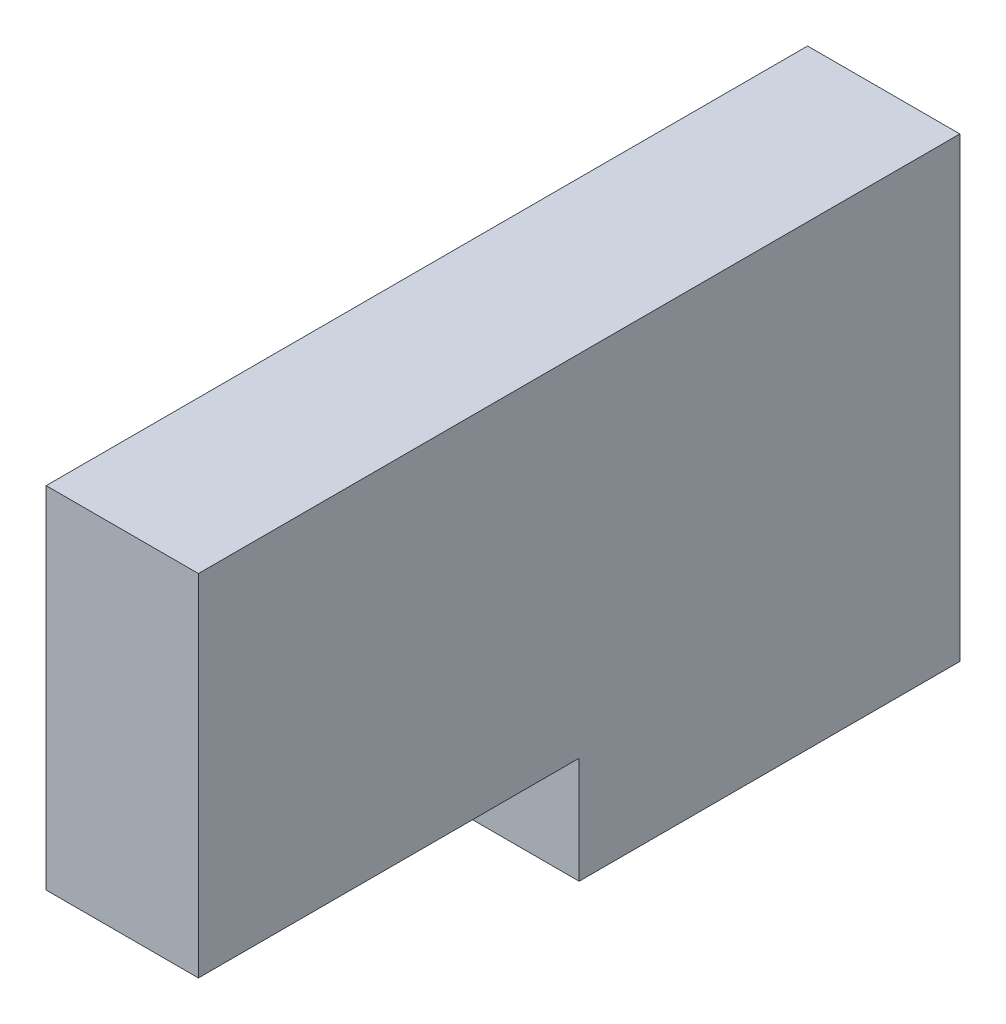
ISO-10303-21;
HEADER;
FILE_DESCRIPTION(('STEP AP214'),'2;1');
FILE_NAME('part.step','',(''),(''),'','','');
FILE_SCHEMA(('AUTOMOTIVE_DESIGN { 1 0 10303 214 1 1 1 1 }'));
ENDSEC;
DATA;
#1=APPLICATION_CONTEXT('core data for automotive mechanical design processes');
#2=APPLICATION_PROTOCOL_DEFINITION('international standard','automotive_design',2000,#1);
#3=PRODUCT_CONTEXT('',#1,'mechanical');
#4=PRODUCT('Part','Part','',(#3));
#5=PRODUCT_RELATED_PRODUCT_CATEGORY('part','',(#4));
#6=PRODUCT_DEFINITION_FORMATION('','',#4);
#7=PRODUCT_DEFINITION_CONTEXT('part definition',#1,'design');
#8=PRODUCT_DEFINITION('design','',#6,#7);
#9=PRODUCT_DEFINITION_SHAPE('','',#8);
#10=(LENGTH_UNIT() NAMED_UNIT(*) SI_UNIT(.MILLI.,.METRE.));
#11=(NAMED_UNIT(*) PLANE_ANGLE_UNIT() SI_UNIT($,.RADIAN.));
#12=(NAMED_UNIT(*) SI_UNIT($,.STERADIAN.) SOLID_ANGLE_UNIT());
#13=UNCERTAINTY_MEASURE_WITH_UNIT(LENGTH_MEASURE(1.E-05),#10,'distance_accuracy_value','');
#14=(GEOMETRIC_REPRESENTATION_CONTEXT(3) GLOBAL_UNCERTAINTY_ASSIGNED_CONTEXT((#13)) GLOBAL_UNIT_ASSIGNED_CONTEXT((#10,
#11,#12)) REPRESENTATION_CONTEXT('',''));
#15=CARTESIAN_POINT('',(0.,0.,0.));
#16=DIRECTION('',(0.,0.,1.));
#17=DIRECTION('',(1.,0.,0.));
#18=AXIS2_PLACEMENT_3D('',#15,#16,#17);
#19=CARTESIAN_POINT('',(0.,0.,25.));
#20=DIRECTION('',(0.,0.,-1.));
#21=DIRECTION('',(-1.,0.,0.));
#22=AXIS2_PLACEMENT_3D('',#19,#20,#21);
#23=PLANE('',#22);
#24=DIRECTION('',(1.,0.,0.));
#25=VECTOR('',#24,1.);
#26=CARTESIAN_POINT('',(0.,7.,25.));
#27=LINE('',#26,#25);
#28=CARTESIAN_POINT('',(0.,7.,25.));
#29=VERTEX_POINT('',#28);
#30=CARTESIAN_POINT('',(10.,7.,25.));
#31=VERTEX_POINT('',#30);
#32=EDGE_CURVE('E47',#29,#31,#27,.T.);
#33=ORIENTED_EDGE('',*,*,#32,.F.);
#34=DIRECTION('',(0.,-1.,0.));
#35=VECTOR('',#34,1.);
#36=CARTESIAN_POINT('',(0.,0.,25.));
#37=LINE('',#36,#35);
#38=CARTESIAN_POINT('',(0.,0.,25.));
#39=VERTEX_POINT('',#38);
#40=EDGE_CURVE('E108',#29,#39,#37,.T.);
#41=ORIENTED_EDGE('',*,*,#40,.T.);
#42=DIRECTION('',(1.,0.,0.));
#43=VECTOR('',#42,1.);
#44=CARTESIAN_POINT('',(0.,0.,25.));
#45=LINE('',#44,#43);
#46=CARTESIAN_POINT('',(10.,0.,25.));
#47=VERTEX_POINT('',#46);
#48=EDGE_CURVE('E110',#39,#47,#45,.T.);
#49=ORIENTED_EDGE('',*,*,#48,.T.);
#50=DIRECTION('',(0.,1.,0.));
#51=VECTOR('',#50,1.);
#52=CARTESIAN_POINT('',(10.,0.,25.));
#53=LINE('',#52,#51);
#54=EDGE_CURVE('E117',#47,#31,#53,.T.);
#55=ORIENTED_EDGE('',*,*,#54,.T.);
#56=EDGE_LOOP('',(#33,#41,#49,#55));
#57=FACE_BOUND('',#56,.T.);
#58=ADVANCED_FACE('F32',(#57),#23,.F.);
#59=CARTESIAN_POINT('',(0.,0.,0.));
#60=DIRECTION('',(0.,0.,-1.));
#61=DIRECTION('',(-1.,0.,0.));
#62=AXIS2_PLACEMENT_3D('',#59,#60,#61);
#63=PLANE('',#62);
#64=CARTESIAN_POINT('',(5.,15.,0.));
#65=DIRECTION('',(0.,0.,1.));
#66=DIRECTION('',(1.,0.,0.));
#67=AXIS2_PLACEMENT_3D('',#64,#65,#66);
#68=CIRCLE('',#67,1.75);
#69=CARTESIAN_POINT('',(6.75,15.,0.));
#70=VERTEX_POINT('',#69);
#71=EDGE_CURVE('E131',#70,#70,#68,.T.);
#72=ORIENTED_EDGE('',*,*,#71,.T.);
#73=EDGE_LOOP('',(#72));
#74=FACE_BOUND('',#73,.T.);
#75=DIRECTION('',(0.,-1.,0.));
#76=VECTOR('',#75,1.);
#77=CARTESIAN_POINT('',(0.,0.,0.));
#78=LINE('',#77,#76);
#79=CARTESIAN_POINT('',(0.,30.,0.));
#80=VERTEX_POINT('',#79);
#81=CARTESIAN_POINT('',(0.,0.,0.));
#82=VERTEX_POINT('',#81);
#83=EDGE_CURVE('E137',#80,#82,#78,.T.);
#84=ORIENTED_EDGE('',*,*,#83,.F.);
#85=DIRECTION('',(-1.,0.,0.));
#86=VECTOR('',#85,1.);
#87=CARTESIAN_POINT('',(0.,30.,0.));
#88=LINE('',#87,#86);
#89=CARTESIAN_POINT('',(10.,30.,0.));
#90=VERTEX_POINT('',#89);
#91=EDGE_CURVE('E55',#90,#80,#88,.T.);
#92=ORIENTED_EDGE('',*,*,#91,.F.);
#93=DIRECTION('',(0.,1.,0.));
#94=VECTOR('',#93,1.);
#95=CARTESIAN_POINT('',(10.,0.,0.));
#96=LINE('',#95,#94);
#97=CARTESIAN_POINT('',(10.,0.,0.));
#98=VERTEX_POINT('',#97);
#99=EDGE_CURVE('E141',#98,#90,#96,.T.);
#100=ORIENTED_EDGE('',*,*,#99,.F.);
#101=DIRECTION('',(1.,0.,0.));
#102=VECTOR('',#101,1.);
#103=CARTESIAN_POINT('',(0.,0.,0.));
#104=LINE('',#103,#102);
#105=EDGE_CURVE('E139',#82,#98,#104,.T.);
#106=ORIENTED_EDGE('',*,*,#105,.F.);
#107=EDGE_LOOP('',(#84,#92,#100,#106));
#108=FACE_BOUND('',#107,.T.);
#109=CARTESIAN_POINT('',(5.,5.,0.));
#110=DIRECTION('',(0.,0.,1.));
#111=DIRECTION('',(1.,0.,0.));
#112=AXIS2_PLACEMENT_3D('',#109,#110,#111);
#113=CIRCLE('',#112,1.75);
#114=CARTESIAN_POINT('',(6.75,5.,0.));
#115=VERTEX_POINT('',#114);
#116=EDGE_CURVE('E134',#115,#115,#113,.T.);
#117=ORIENTED_EDGE('',*,*,#116,.T.);
#118=EDGE_LOOP('',(#117));
#119=FACE_BOUND('',#118,.T.);
#120=CARTESIAN_POINT('',(5.,25.,0.));
#121=DIRECTION('',(0.,0.,1.));
#122=DIRECTION('',(1.,0.,0.));
#123=AXIS2_PLACEMENT_3D('',#120,#121,#122);
#124=CIRCLE('',#123,1.75);
#125=CARTESIAN_POINT('',(6.75,25.,0.));
#126=VERTEX_POINT('',#125);
#127=EDGE_CURVE('E128',#126,#126,#124,.T.);
#128=ORIENTED_EDGE('',*,*,#127,.T.);
#129=EDGE_LOOP('',(#128));
#130=FACE_BOUND('',#129,.T.);
#131=ADVANCED_FACE('F156',(#74,#108,#119,#130),#63,.T.);
#132=CARTESIAN_POINT('',(0.,0.,20.));
#133=DIRECTION('',(1.,0.,0.));
#134=DIRECTION('',(0.,0.,-1.));
#135=AXIS2_PLACEMENT_3D('',#132,#133,#134);
#136=PLANE('',#135);
#137=ORIENTED_EDGE('',*,*,#83,.T.);
#138=DIRECTION('',(0.,0.,-1.));
#139=VECTOR('',#138,1.);
#140=CARTESIAN_POINT('',(0.,0.,20.));
#141=LINE('',#140,#139);
#142=EDGE_CURVE('E11',#39,#82,#141,.T.);
#143=ORIENTED_EDGE('',*,*,#142,.F.);
#144=ORIENTED_EDGE('',*,*,#40,.F.);
#145=DIRECTION('',(0.,0.,-1.));
#146=VECTOR('',#145,1.);
#147=CARTESIAN_POINT('',(0.,7.,50.));
#148=LINE('',#147,#146);
#149=CARTESIAN_POINT('',(0.,7.,50.));
#150=VERTEX_POINT('',#149);
#151=EDGE_CURVE('E90',#150,#29,#148,.T.);
#152=ORIENTED_EDGE('',*,*,#151,.F.);
#153=DIRECTION('',(0.,-1.,0.));
#154=VECTOR('',#153,1.);
#155=CARTESIAN_POINT('',(0.,30.,50.));
#156=LINE('',#155,#154);
#157=CARTESIAN_POINT('',(0.,30.,50.));
#158=VERTEX_POINT('',#157);
#159=EDGE_CURVE('E97',#158,#150,#156,.T.);
#160=ORIENTED_EDGE('',*,*,#159,.F.);
#161=DIRECTION('',(0.,0.,-1.));
#162=VECTOR('',#161,1.);
#163=CARTESIAN_POINT('',(0.,30.,20.));
#164=LINE('',#163,#162);
#165=EDGE_CURVE('E144',#158,#80,#164,.T.);
#166=ORIENTED_EDGE('',*,*,#165,.T.);
#167=EDGE_LOOP('',(#137,#143,#144,#152,#160,#166));
#168=FACE_BOUND('',#167,.T.);
#169=ADVANCED_FACE('F34',(#168),#136,.F.);
#170=CARTESIAN_POINT('',(0.,0.,20.));
#171=DIRECTION('',(0.,1.,0.));
#172=DIRECTION('',(0.,0.,1.));
#173=AXIS2_PLACEMENT_3D('',#170,#171,#172);
#174=PLANE('',#173);
#175=ORIENTED_EDGE('',*,*,#105,.T.);
#176=DIRECTION('',(0.,0.,-1.));
#177=VECTOR('',#176,1.);
#178=CARTESIAN_POINT('',(10.,0.,20.));
#179=LINE('',#178,#177);
#180=EDGE_CURVE('E40',#47,#98,#179,.T.);
#181=ORIENTED_EDGE('',*,*,#180,.F.);
#182=ORIENTED_EDGE('',*,*,#48,.F.);
#183=ORIENTED_EDGE('',*,*,#142,.T.);
#184=EDGE_LOOP('',(#175,#181,#182,#183));
#185=FACE_BOUND('',#184,.T.);
#186=ADVANCED_FACE('F230',(#185),#174,.F.);
#187=CARTESIAN_POINT('',(10.,0.,20.));
#188=DIRECTION('',(-1.,0.,0.));
#189=DIRECTION('',(0.,0.,1.));
#190=AXIS2_PLACEMENT_3D('',#187,#188,#189);
#191=PLANE('',#190);
#192=ORIENTED_EDGE('',*,*,#99,.T.);
#193=DIRECTION('',(0.,0.,-1.));
#194=VECTOR('',#193,1.);
#195=CARTESIAN_POINT('',(10.,30.,20.));
#196=LINE('',#195,#194);
#197=CARTESIAN_POINT('',(10.,30.,50.));
#198=VERTEX_POINT('',#197);
#199=EDGE_CURVE('E146',#198,#90,#196,.T.);
#200=ORIENTED_EDGE('',*,*,#199,.F.);
#201=DIRECTION('',(0.,1.,0.));
#202=VECTOR('',#201,1.);
#203=CARTESIAN_POINT('',(10.,30.,50.));
#204=LINE('',#203,#202);
#205=CARTESIAN_POINT('',(10.,7.,50.));
#206=VERTEX_POINT('',#205);
#207=EDGE_CURVE('E96',#206,#198,#204,.T.);
#208=ORIENTED_EDGE('',*,*,#207,.F.);
#209=DIRECTION('',(0.,0.,-1.));
#210=VECTOR('',#209,1.);
#211=CARTESIAN_POINT('',(10.,7.,50.));
#212=LINE('',#211,#210);
#213=EDGE_CURVE('E92',#206,#31,#212,.T.);
#214=ORIENTED_EDGE('',*,*,#213,.T.);
#215=ORIENTED_EDGE('',*,*,#54,.F.);
#216=ORIENTED_EDGE('',*,*,#180,.T.);
#217=EDGE_LOOP('',(#192,#200,#208,#214,#215,#216));
#218=FACE_BOUND('',#217,.T.);
#219=ADVANCED_FACE('F151',(#218),#191,.F.);
#220=CARTESIAN_POINT('',(0.,30.,20.));
#221=DIRECTION('',(0.,-1.,0.));
#222=DIRECTION('',(0.,0.,-1.));
#223=AXIS2_PLACEMENT_3D('',#220,#221,#222);
#224=PLANE('',#223);
#225=ORIENTED_EDGE('',*,*,#91,.T.);
#226=ORIENTED_EDGE('',*,*,#165,.F.);
#227=DIRECTION('',(-1.,0.,0.));
#228=VECTOR('',#227,1.);
#229=CARTESIAN_POINT('',(0.,30.,50.));
#230=LINE('',#229,#228);
#231=EDGE_CURVE('E103',#198,#158,#230,.T.);
#232=ORIENTED_EDGE('',*,*,#231,.F.);
#233=ORIENTED_EDGE('',*,*,#199,.T.);
#234=EDGE_LOOP('',(#225,#226,#232,#233));
#235=FACE_BOUND('',#234,.T.);
#236=ADVANCED_FACE('F158',(#235),#224,.F.);
#237=CARTESIAN_POINT('',(5.,5.,20.));
#238=DIRECTION('',(0.,0.,-1.));
#239=DIRECTION('',(-1.,0.,0.));
#240=AXIS2_PLACEMENT_3D('',#237,#238,#239);
#241=CYLINDRICAL_SURFACE('',#240,1.75);
#242=CARTESIAN_POINT('',(5.,5.,20.));
#243=DIRECTION('',(0.,0.,-1.));
#244=DIRECTION('',(-1.,0.,0.));
#245=AXIS2_PLACEMENT_3D('',#242,#243,#244);
#246=CIRCLE('',#245,1.75);
#247=CARTESIAN_POINT('',(3.25,5.,20.));
#248=VERTEX_POINT('',#247);
#249=EDGE_CURVE('E125',#248,#248,#246,.T.);
#250=ORIENTED_EDGE('',*,*,#249,.F.);
#251=EDGE_LOOP('',(#250));
#252=FACE_BOUND('',#251,.T.);
#253=ORIENTED_EDGE('',*,*,#116,.F.);
#254=EDGE_LOOP('',(#253));
#255=FACE_BOUND('',#254,.T.);
#256=ADVANCED_FACE('F222',(#252,#255),#241,.F.);
#257=CARTESIAN_POINT('',(5.,15.,20.));
#258=DIRECTION('',(0.,0.,-1.));
#259=DIRECTION('',(-1.,0.,0.));
#260=AXIS2_PLACEMENT_3D('',#257,#258,#259);
#261=CYLINDRICAL_SURFACE('',#260,1.75);
#262=CARTESIAN_POINT('',(5.,15.,20.));
#263=DIRECTION('',(0.,0.,-1.));
#264=DIRECTION('',(-1.,0.,0.));
#265=AXIS2_PLACEMENT_3D('',#262,#263,#264);
#266=CIRCLE('',#265,1.75);
#267=CARTESIAN_POINT('',(3.25,15.,20.));
#268=VERTEX_POINT('',#267);
#269=EDGE_CURVE('E122',#268,#268,#266,.T.);
#270=ORIENTED_EDGE('',*,*,#269,.F.);
#271=EDGE_LOOP('',(#270));
#272=FACE_BOUND('',#271,.T.);
#273=ORIENTED_EDGE('',*,*,#71,.F.);
#274=EDGE_LOOP('',(#273));
#275=FACE_BOUND('',#274,.T.);
#276=ADVANCED_FACE('F218',(#272,#275),#261,.F.);
#277=CARTESIAN_POINT('',(5.,25.,20.));
#278=DIRECTION('',(0.,0.,-1.));
#279=DIRECTION('',(-1.,0.,0.));
#280=AXIS2_PLACEMENT_3D('',#277,#278,#279);
#281=CYLINDRICAL_SURFACE('',#280,1.75);
#282=CARTESIAN_POINT('',(5.,25.,20.));
#283=DIRECTION('',(0.,0.,-1.));
#284=DIRECTION('',(-1.,0.,0.));
#285=AXIS2_PLACEMENT_3D('',#282,#283,#284);
#286=CIRCLE('',#285,1.75);
#287=CARTESIAN_POINT('',(3.25,25.,20.));
#288=VERTEX_POINT('',#287);
#289=EDGE_CURVE('E119',#288,#288,#286,.T.);
#290=ORIENTED_EDGE('',*,*,#289,.F.);
#291=EDGE_LOOP('',(#290));
#292=FACE_BOUND('',#291,.T.);
#293=ORIENTED_EDGE('',*,*,#127,.F.);
#294=EDGE_LOOP('',(#293));
#295=FACE_BOUND('',#294,.T.);
#296=ADVANCED_FACE('F215',(#292,#295),#281,.F.);
#297=CARTESIAN_POINT('',(0.,0.,20.));
#298=DIRECTION('',(0.,0.,-1.));
#299=DIRECTION('',(-1.,0.,0.));
#300=AXIS2_PLACEMENT_3D('',#297,#298,#299);
#301=PLANE('',#300);
#302=ORIENTED_EDGE('',*,*,#289,.T.);
#303=EDGE_LOOP('',(#302));
#304=FACE_BOUND('',#303,.T.);
#305=ADVANCED_FACE('F214',(#304),#301,.T.);
#306=ORIENTED_EDGE('',*,*,#269,.T.);
#307=EDGE_LOOP('',(#306));
#308=FACE_BOUND('',#307,.T.);
#309=ADVANCED_FACE('F212',(#308),#301,.T.);
#310=ORIENTED_EDGE('',*,*,#249,.T.);
#311=EDGE_LOOP('',(#310));
#312=FACE_BOUND('',#311,.T.);
#313=ADVANCED_FACE('F188',(#312),#301,.T.);
#314=CARTESIAN_POINT('',(0.,7.,50.));
#315=DIRECTION('',(0.,1.,0.));
#316=DIRECTION('',(-1.,0.,0.));
#317=AXIS2_PLACEMENT_3D('',#314,#315,#316);
#318=PLANE('',#317);
#319=CARTESIAN_POINT('',(5.,7.,35.));
#320=DIRECTION('',(0.,-1.,0.));
#321=DIRECTION('',(1.,0.,0.));
#322=AXIS2_PLACEMENT_3D('',#319,#320,#321);
#323=CIRCLE('',#322,1.75);
#324=CARTESIAN_POINT('',(6.75,7.,35.));
#325=VERTEX_POINT('',#324);
#326=EDGE_CURVE('E171',#325,#325,#323,.T.);
#327=ORIENTED_EDGE('',*,*,#326,.F.);
#328=EDGE_LOOP('',(#327));
#329=FACE_BOUND('',#328,.T.);
#330=CARTESIAN_POINT('',(5.,7.,45.));
#331=DIRECTION('',(0.,-1.,0.));
#332=DIRECTION('',(1.,0.,0.));
#333=AXIS2_PLACEMENT_3D('',#330,#331,#332);
#334=CIRCLE('',#333,1.75);
#335=CARTESIAN_POINT('',(6.75,7.,45.));
#336=VERTEX_POINT('',#335);
#337=EDGE_CURVE('E163',#336,#336,#334,.T.);
#338=ORIENTED_EDGE('',*,*,#337,.F.);
#339=EDGE_LOOP('',(#338));
#340=FACE_BOUND('',#339,.T.);
#341=ORIENTED_EDGE('',*,*,#32,.T.);
#342=ORIENTED_EDGE('',*,*,#213,.F.);
#343=DIRECTION('',(1.,0.,0.));
#344=VECTOR('',#343,1.);
#345=CARTESIAN_POINT('',(0.,7.,50.));
#346=LINE('',#345,#344);
#347=EDGE_CURVE('E86',#150,#206,#346,.T.);
#348=ORIENTED_EDGE('',*,*,#347,.F.);
#349=ORIENTED_EDGE('',*,*,#151,.T.);
#350=EDGE_LOOP('',(#341,#342,#348,#349));
#351=FACE_BOUND('',#350,.T.);
#352=ADVANCED_FACE('F88',(#329,#340,#351),#318,.F.);
#353=CARTESIAN_POINT('',(0.,0.,50.));
#354=DIRECTION('',(0.,0.,1.));
#355=DIRECTION('',(1.,0.,0.));
#356=AXIS2_PLACEMENT_3D('',#353,#354,#355);
#357=PLANE('',#356);
#358=ORIENTED_EDGE('',*,*,#159,.T.);
#359=ORIENTED_EDGE('',*,*,#347,.T.);
#360=ORIENTED_EDGE('',*,*,#207,.T.);
#361=ORIENTED_EDGE('',*,*,#231,.T.);
#362=EDGE_LOOP('',(#358,#359,#360,#361));
#363=FACE_BOUND('',#362,.T.);
#364=ADVANCED_FACE('F101',(#363),#357,.T.);
#365=CARTESIAN_POINT('',(5.,22.,45.));
#366=DIRECTION('',(0.,-1.,0.));
#367=DIRECTION('',(1.,0.,0.));
#368=AXIS2_PLACEMENT_3D('',#365,#366,#367);
#369=CYLINDRICAL_SURFACE('',#368,1.75);
#370=CARTESIAN_POINT('',(5.,22.,45.));
#371=DIRECTION('',(0.,-1.,0.));
#372=DIRECTION('',(1.,0.,0.));
#373=AXIS2_PLACEMENT_3D('',#370,#371,#372);
#374=CIRCLE('',#373,1.75);
#375=CARTESIAN_POINT('',(6.75,22.,45.));
#376=VERTEX_POINT('',#375);
#377=EDGE_CURVE('E161',#376,#376,#374,.T.);
#378=ORIENTED_EDGE('',*,*,#377,.F.);
#379=EDGE_LOOP('',(#378));
#380=FACE_BOUND('',#379,.T.);
#381=ORIENTED_EDGE('',*,*,#337,.T.);
#382=EDGE_LOOP('',(#381));
#383=FACE_BOUND('',#382,.T.);
#384=ADVANCED_FACE('F192',(#380,#383),#369,.F.);
#385=CARTESIAN_POINT('',(5.,22.,45.));
#386=DIRECTION('',(0.,-1.,0.));
#387=DIRECTION('',(1.,0.,0.));
#388=AXIS2_PLACEMENT_3D('',#385,#386,#387);
#389=PLANE('',#388);
#390=ORIENTED_EDGE('',*,*,#377,.T.);
#391=EDGE_LOOP('',(#390));
#392=FACE_BOUND('',#391,.T.);
#393=ADVANCED_FACE('F182',(#392),#389,.T.);
#394=CARTESIAN_POINT('',(5.,22.,35.));
#395=DIRECTION('',(0.,-1.,0.));
#396=DIRECTION('',(1.,0.,0.));
#397=AXIS2_PLACEMENT_3D('',#394,#395,#396);
#398=CYLINDRICAL_SURFACE('',#397,1.75);
#399=CARTESIAN_POINT('',(5.,22.,35.));
#400=DIRECTION('',(0.,-1.,0.));
#401=DIRECTION('',(1.,0.,0.));
#402=AXIS2_PLACEMENT_3D('',#399,#400,#401);
#403=CIRCLE('',#402,1.75);
#404=CARTESIAN_POINT('',(6.75,22.,35.));
#405=VERTEX_POINT('',#404);
#406=EDGE_CURVE('E168',#405,#405,#403,.T.);
#407=ORIENTED_EDGE('',*,*,#406,.F.);
#408=EDGE_LOOP('',(#407));
#409=FACE_BOUND('',#408,.T.);
#410=ORIENTED_EDGE('',*,*,#326,.T.);
#411=EDGE_LOOP('',(#410));
#412=FACE_BOUND('',#411,.T.);
#413=ADVANCED_FACE('F179',(#409,#412),#398,.F.);
#414=CARTESIAN_POINT('',(5.,22.,35.));
#415=DIRECTION('',(0.,-1.,0.));
#416=DIRECTION('',(1.,0.,0.));
#417=AXIS2_PLACEMENT_3D('',#414,#415,#416);
#418=PLANE('',#417);
#419=ORIENTED_EDGE('',*,*,#406,.T.);
#420=EDGE_LOOP('',(#419));
#421=FACE_BOUND('',#420,.T.);
#422=ADVANCED_FACE('F177',(#421),#418,.T.);
#423=CLOSED_SHELL('',(#58,#131,#169,#186,#219,#236,#256,#276,#296,#305,#309,#313,#352,#364,#384,
#393,#413,#422));
#424=MANIFOLD_SOLID_BREP('B2',#423);
#425=ADVANCED_BREP_SHAPE_REPRESENTATION('',(#18,#424),#14);
#426=SHAPE_DEFINITION_REPRESENTATION(#9,#425);
ENDSEC;
END-ISO-10303-21;
